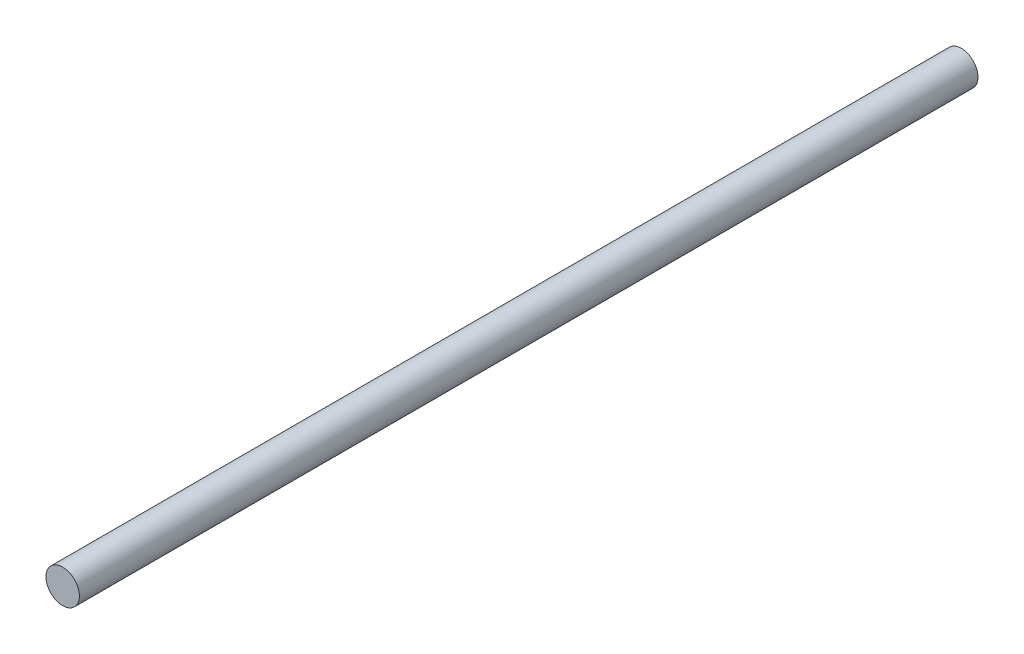
ISO-10303-21;
HEADER;
FILE_DESCRIPTION(('STEP AP214'),'2;1');
FILE_NAME('part.step','',(''),(''),'','','');
FILE_SCHEMA(('AUTOMOTIVE_DESIGN { 1 0 10303 214 1 1 1 1 }'));
ENDSEC;
DATA;
#1=APPLICATION_CONTEXT('core data for automotive mechanical design processes');
#2=APPLICATION_PROTOCOL_DEFINITION('international standard','automotive_design',2000,#1);
#3=PRODUCT_CONTEXT('',#1,'mechanical');
#4=PRODUCT('Part','Part','',(#3));
#5=PRODUCT_RELATED_PRODUCT_CATEGORY('part','',(#4));
#6=PRODUCT_DEFINITION_FORMATION('','',#4);
#7=PRODUCT_DEFINITION_CONTEXT('part definition',#1,'design');
#8=PRODUCT_DEFINITION('design','',#6,#7);
#9=PRODUCT_DEFINITION_SHAPE('','',#8);
#10=(LENGTH_UNIT() NAMED_UNIT(*) SI_UNIT(.MILLI.,.METRE.));
#11=(NAMED_UNIT(*) PLANE_ANGLE_UNIT() SI_UNIT($,.RADIAN.));
#12=(NAMED_UNIT(*) SI_UNIT($,.STERADIAN.) SOLID_ANGLE_UNIT());
#13=UNCERTAINTY_MEASURE_WITH_UNIT(LENGTH_MEASURE(1.E-05),#10,'distance_accuracy_value','');
#14=(GEOMETRIC_REPRESENTATION_CONTEXT(3) GLOBAL_UNCERTAINTY_ASSIGNED_CONTEXT((#13)) GLOBAL_UNIT_ASSIGNED_CONTEXT((#10,
#11,#12)) REPRESENTATION_CONTEXT('',''));
#15=CARTESIAN_POINT('',(0.,0.,0.));
#16=DIRECTION('',(0.,0.,1.));
#17=DIRECTION('',(1.,0.,0.));
#18=AXIS2_PLACEMENT_3D('',#15,#16,#17);
#19=CARTESIAN_POINT('',(0.,0.,215.));
#20=DIRECTION('',(0.,0.,-1.));
#21=DIRECTION('',(-1.,0.,0.));
#22=AXIS2_PLACEMENT_3D('',#19,#20,#21);
#23=CYLINDRICAL_SURFACE('',#22,4.);
#24=CARTESIAN_POINT('',(0.,0.,215.));
#25=DIRECTION('',(0.,0.,1.));
#26=DIRECTION('',(1.,0.,0.));
#27=AXIS2_PLACEMENT_3D('',#24,#25,#26);
#28=CIRCLE('',#27,4.);
#29=CARTESIAN_POINT('',(4.,0.,215.));
#30=VERTEX_POINT('',#29);
#31=EDGE_CURVE('E10',#30,#30,#28,.T.);
#32=ORIENTED_EDGE('',*,*,#31,.F.);
#33=EDGE_LOOP('',(#32));
#34=FACE_BOUND('',#33,.T.);
#35=CARTESIAN_POINT('',(0.,0.,0.));
#36=DIRECTION('',(0.,0.,1.));
#37=DIRECTION('',(1.,0.,0.));
#38=AXIS2_PLACEMENT_3D('',#35,#36,#37);
#39=CIRCLE('',#38,4.);
#40=CARTESIAN_POINT('',(4.,0.,0.));
#41=VERTEX_POINT('',#40);
#42=EDGE_CURVE('E40',#41,#41,#39,.T.);
#43=ORIENTED_EDGE('',*,*,#42,.T.);
#44=EDGE_LOOP('',(#43));
#45=FACE_BOUND('',#44,.T.);
#46=ADVANCED_FACE('F37',(#34,#45),#23,.T.);
#47=CARTESIAN_POINT('',(0.,0.,215.));
#48=DIRECTION('',(0.,0.,1.));
#49=DIRECTION('',(1.,0.,0.));
#50=AXIS2_PLACEMENT_3D('',#47,#48,#49);
#51=PLANE('',#50);
#52=ORIENTED_EDGE('',*,*,#31,.T.);
#53=EDGE_LOOP('',(#52));
#54=FACE_BOUND('',#53,.T.);
#55=ADVANCED_FACE('F54',(#54),#51,.T.);
#56=CARTESIAN_POINT('',(0.,0.,0.));
#57=DIRECTION('',(0.,0.,1.));
#58=DIRECTION('',(1.,0.,0.));
#59=AXIS2_PLACEMENT_3D('',#56,#57,#58);
#60=PLANE('',#59);
#61=ORIENTED_EDGE('',*,*,#42,.F.);
#62=EDGE_LOOP('',(#61));
#63=FACE_BOUND('',#62,.T.);
#64=ADVANCED_FACE('F52',(#63),#60,.F.);
#65=CLOSED_SHELL('',(#46,#55,#64));
#66=MANIFOLD_SOLID_BREP('B2',#65);
#67=ADVANCED_BREP_SHAPE_REPRESENTATION('',(#18,#66),#14);
#68=SHAPE_DEFINITION_REPRESENTATION(#9,#67);
ENDSEC;
END-ISO-10303-21;
